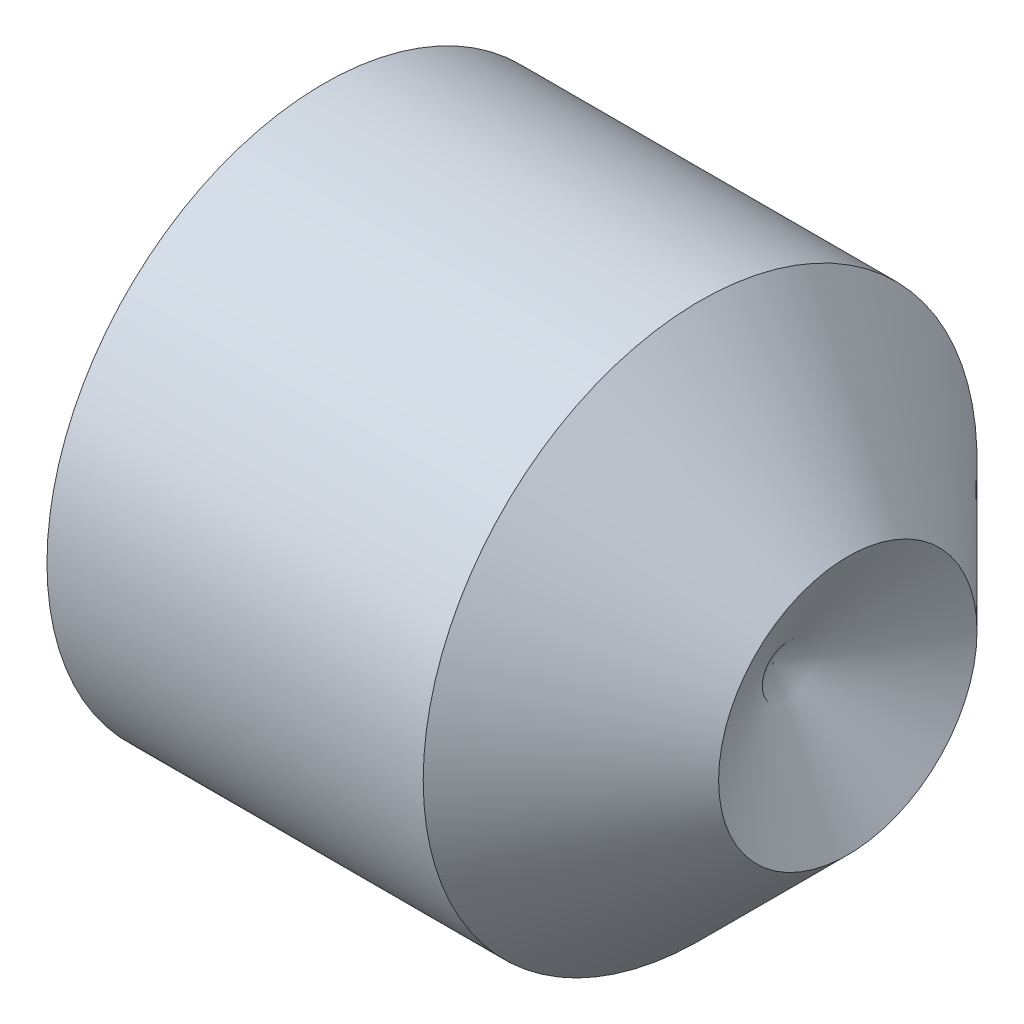
ISO-10303-21;
HEADER;
FILE_DESCRIPTION(('STEP AP214'),'2;1');
FILE_NAME('part.step','',(''),(''),'','','');
FILE_SCHEMA(('AUTOMOTIVE_DESIGN { 1 0 10303 214 1 1 1 1 }'));
ENDSEC;
DATA;
#1=APPLICATION_CONTEXT('core data for automotive mechanical design processes');
#2=APPLICATION_PROTOCOL_DEFINITION('international standard','automotive_design',2000,#1);
#3=PRODUCT_CONTEXT('',#1,'mechanical');
#4=PRODUCT('Part','Part','',(#3));
#5=PRODUCT_RELATED_PRODUCT_CATEGORY('part','',(#4));
#6=PRODUCT_DEFINITION_FORMATION('','',#4);
#7=PRODUCT_DEFINITION_CONTEXT('part definition',#1,'design');
#8=PRODUCT_DEFINITION('design','',#6,#7);
#9=PRODUCT_DEFINITION_SHAPE('','',#8);
#10=(LENGTH_UNIT() NAMED_UNIT(*) SI_UNIT(.MILLI.,.METRE.));
#11=(NAMED_UNIT(*) PLANE_ANGLE_UNIT() SI_UNIT($,.RADIAN.));
#12=(NAMED_UNIT(*) SI_UNIT($,.STERADIAN.) SOLID_ANGLE_UNIT());
#13=UNCERTAINTY_MEASURE_WITH_UNIT(LENGTH_MEASURE(1.E-05),#10,'distance_accuracy_value','');
#14=(GEOMETRIC_REPRESENTATION_CONTEXT(3) GLOBAL_UNCERTAINTY_ASSIGNED_CONTEXT((#13)) GLOBAL_UNIT_ASSIGNED_CONTEXT((#10,
#11,#12)) REPRESENTATION_CONTEXT('',''));
#15=CARTESIAN_POINT('',(0.,0.,0.));
#16=DIRECTION('',(0.,0.,1.));
#17=DIRECTION('',(1.,0.,0.));
#18=AXIS2_PLACEMENT_3D('',#15,#16,#17);
#19=CARTESIAN_POINT('',(0.,0.,0.));
#20=DIRECTION('',(-1.,0.,0.));
#21=DIRECTION('',(0.,0.,1.));
#22=AXIS2_PLACEMENT_3D('',#19,#20,#21);
#23=PLANE('',#22);
#24=CARTESIAN_POINT('',(0.,0.,0.));
#25=DIRECTION('',(-1.,0.,0.));
#26=DIRECTION('',(0.,0.,1.));
#27=AXIS2_PLACEMENT_3D('',#24,#25,#26);
#28=CIRCLE('',#27,1.2195);
#29=CARTESIAN_POINT('',(0.,0.,1.2195));
#30=VERTEX_POINT('',#29);
#31=EDGE_CURVE('E11',#30,#30,#28,.T.);
#32=ORIENTED_EDGE('',*,*,#31,.T.);
#33=EDGE_LOOP('',(#32));
#34=FACE_BOUND('',#33,.T.);
#35=DIRECTION('',(0.,0.,-1.));
#36=VECTOR('',#35,1.);
#37=CARTESIAN_POINT('',(0.,0.750000000000003,0.433012701892216));
#38=LINE('',#37,#36);
#39=CARTESIAN_POINT('',(0.,0.750000000000003,0.433012701892216));
#40=VERTEX_POINT('',#39);
#41=CARTESIAN_POINT('',(0.,0.750000000000003,-0.433012701892222));
#42=VERTEX_POINT('',#41);
#43=EDGE_CURVE('E98',#40,#42,#38,.T.);
#44=ORIENTED_EDGE('',*,*,#43,.F.);
#45=DIRECTION('',(0.,-0.866025403784439,0.5));
#46=VECTOR('',#45,1.);
#47=CARTESIAN_POINT('',(0.,0.750000000000003,0.433012701892216));
#48=LINE('',#47,#46);
#49=CARTESIAN_POINT('',(0.,0.,0.866025403784435));
#50=VERTEX_POINT('',#49);
#51=EDGE_CURVE('E51',#40,#50,#48,.T.);
#52=ORIENTED_EDGE('',*,*,#51,.T.);
#53=DIRECTION('',(0.,0.866025403784439,0.5));
#54=VECTOR('',#53,1.);
#55=CARTESIAN_POINT('',(0.,-0.749999999999996,0.433012701892216));
#56=LINE('',#55,#54);
#57=CARTESIAN_POINT('',(0.,-0.749999999999996,0.433012701892216));
#58=VERTEX_POINT('',#57);
#59=EDGE_CURVE('E104',#58,#50,#56,.T.);
#60=ORIENTED_EDGE('',*,*,#59,.F.);
#61=DIRECTION('',(0.,0.,-1.));
#62=VECTOR('',#61,1.);
#63=CARTESIAN_POINT('',(0.,-0.749999999999996,0.433012701892216));
#64=LINE('',#63,#62);
#65=CARTESIAN_POINT('',(0.,-0.749999999999996,-0.433012701892222));
#66=VERTEX_POINT('',#65);
#67=EDGE_CURVE('E124',#58,#66,#64,.T.);
#68=ORIENTED_EDGE('',*,*,#67,.T.);
#69=DIRECTION('',(0.,0.866025403784438,-0.500000000000001));
#70=VECTOR('',#69,1.);
#71=CARTESIAN_POINT('',(0.,-0.749999999999996,-0.433012701892222));
#72=LINE('',#71,#70);
#73=CARTESIAN_POINT('',(0.,0.,-0.866025403784441));
#74=VERTEX_POINT('',#73);
#75=EDGE_CURVE('E127',#66,#74,#72,.T.);
#76=ORIENTED_EDGE('',*,*,#75,.T.);
#77=DIRECTION('',(0.,-0.866025403784439,-0.5));
#78=VECTOR('',#77,1.);
#79=CARTESIAN_POINT('',(0.,0.750000000000003,-0.433012701892222));
#80=LINE('',#79,#78);
#81=EDGE_CURVE('E130',#42,#74,#80,.T.);
#82=ORIENTED_EDGE('',*,*,#81,.F.);
#83=EDGE_LOOP('',(#44,#52,#60,#68,#76,#82));
#84=FACE_BOUND('',#83,.T.);
#85=ADVANCED_FACE('F37',(#34,#84),#23,.T.);
#86=CARTESIAN_POINT('',(0.,0.,0.));
#87=DIRECTION('',(1.,0.,0.));
#88=DIRECTION('',(0.,0.,-1.));
#89=AXIS2_PLACEMENT_3D('',#86,#87,#88);
#90=CONICAL_SURFACE('',#89,1.2195,1.0471975511966);
#91=CARTESIAN_POINT('',(0.161946750507689,0.,0.));
#92=DIRECTION('',(-1.,0.,0.));
#93=DIRECTION('',(0.,0.,1.));
#94=AXIS2_PLACEMENT_3D('',#91,#92,#93);
#95=CIRCLE('',#94,1.5);
#96=CARTESIAN_POINT('',(0.161946750507689,0.,1.5));
#97=VERTEX_POINT('',#96);
#98=EDGE_CURVE('E44',#97,#97,#95,.T.);
#99=ORIENTED_EDGE('',*,*,#98,.T.);
#100=EDGE_LOOP('',(#99));
#101=FACE_BOUND('',#100,.T.);
#102=ORIENTED_EDGE('',*,*,#31,.F.);
#103=EDGE_LOOP('',(#102));
#104=FACE_BOUND('',#103,.T.);
#105=ADVANCED_FACE('F150',(#101,#104),#90,.T.);
#106=CARTESIAN_POINT('',(-12.7,0.,0.));
#107=DIRECTION('',(-1.,0.,0.));
#108=DIRECTION('',(0.,0.,1.));
#109=AXIS2_PLACEMENT_3D('',#106,#107,#108);
#110=CYLINDRICAL_SURFACE('',#109,1.5);
#111=CARTESIAN_POINT('',(2.2,0.,0.));
#112=DIRECTION('',(-1.,0.,0.));
#113=DIRECTION('',(0.,0.,1.));
#114=AXIS2_PLACEMENT_3D('',#111,#112,#113);
#115=CIRCLE('',#114,1.5);
#116=CARTESIAN_POINT('',(2.2,0.,1.5));
#117=VERTEX_POINT('',#116);
#118=EDGE_CURVE('E145',#117,#117,#115,.T.);
#119=ORIENTED_EDGE('',*,*,#118,.T.);
#120=EDGE_LOOP('',(#119));
#121=FACE_BOUND('',#120,.T.);
#122=ORIENTED_EDGE('',*,*,#98,.F.);
#123=EDGE_LOOP('',(#122));
#124=FACE_BOUND('',#123,.T.);
#125=ADVANCED_FACE('F153',(#121,#124),#110,.T.);
#126=CARTESIAN_POINT('',(2.2,0.,0.));
#127=DIRECTION('',(-1.,0.,0.));
#128=DIRECTION('',(0.,0.,1.));
#129=AXIS2_PLACEMENT_3D('',#126,#127,#128);
#130=CONICAL_SURFACE('',#129,1.5,0.785398163397449);
#131=CARTESIAN_POINT('',(3.,0.,0.));
#132=DIRECTION('',(-1.,0.,0.));
#133=DIRECTION('',(0.,0.,1.));
#134=AXIS2_PLACEMENT_3D('',#131,#132,#133);
#135=CIRCLE('',#134,0.7);
#136=CARTESIAN_POINT('',(3.,0.,0.7));
#137=VERTEX_POINT('',#136);
#138=EDGE_CURVE('E105',#137,#137,#135,.T.);
#139=ORIENTED_EDGE('',*,*,#138,.T.);
#140=EDGE_LOOP('',(#139));
#141=FACE_BOUND('',#140,.T.);
#142=ORIENTED_EDGE('',*,*,#118,.F.);
#143=EDGE_LOOP('',(#142));
#144=FACE_BOUND('',#143,.T.);
#145=ADVANCED_FACE('F155',(#141,#144),#130,.T.);
#146=CARTESIAN_POINT('',(2.59585481156726,0.,0.));
#147=DIRECTION('',(1.,0.,0.));
#148=DIRECTION('',(0.,0.,-1.));
#149=AXIS2_PLACEMENT_3D('',#146,#147,#148);
#150=CONICAL_SURFACE('',#149,0.,1.0471975511966);
#151=ORIENTED_EDGE('',*,*,#138,.F.);
#152=EDGE_LOOP('',(#151));
#153=FACE_BOUND('',#152,.T.);
#154=CARTESIAN_POINT('',(2.59585481156726,0.,0.));
#155=VERTEX_POINT('',#154);
#156=VERTEX_LOOP('',#155);
#157=FACE_BOUND('',#156,.T.);
#158=ADVANCED_FACE('F162',(#153,#157),#150,.F.);
#159=CARTESIAN_POINT('',(1.2,0.750000000000003,0.433012701892216));
#160=DIRECTION('',(0.,-0.5,-0.866025403784438));
#161=DIRECTION('',(0.,0.866025403784438,-0.5));
#162=AXIS2_PLACEMENT_3D('',#159,#160,#161);
#163=PLANE('',#162);
#164=ORIENTED_EDGE('',*,*,#51,.F.);
#165=DIRECTION('',(-1.,0.,0.));
#166=VECTOR('',#165,1.);
#167=CARTESIAN_POINT('',(1.2,0.750000000000003,0.433012701892216));
#168=LINE('',#167,#166);
#169=CARTESIAN_POINT('',(1.2,0.750000000000003,0.433012701892216));
#170=VERTEX_POINT('',#169);
#171=EDGE_CURVE('E92',#170,#40,#168,.T.);
#172=ORIENTED_EDGE('',*,*,#171,.F.);
#173=DIRECTION('',(0.,-0.866025403784439,0.5));
#174=VECTOR('',#173,1.);
#175=CARTESIAN_POINT('',(1.2,0.750000000000003,0.433012701892216));
#176=LINE('',#175,#174);
#177=CARTESIAN_POINT('',(1.2,0.,0.866025403784435));
#178=VERTEX_POINT('',#177);
#179=EDGE_CURVE('E87',#170,#178,#176,.T.);
#180=ORIENTED_EDGE('',*,*,#179,.T.);
#181=DIRECTION('',(-1.,0.,0.));
#182=VECTOR('',#181,1.);
#183=CARTESIAN_POINT('',(1.2,0.,0.866025403784435));
#184=LINE('',#183,#182);
#185=EDGE_CURVE('E90',#178,#50,#184,.T.);
#186=ORIENTED_EDGE('',*,*,#185,.T.);
#187=EDGE_LOOP('',(#164,#172,#180,#186));
#188=FACE_BOUND('',#187,.T.);
#189=ADVANCED_FACE('F89',(#188),#163,.T.);
#190=CARTESIAN_POINT('',(1.2,-0.749999999999996,0.433012701892216));
#191=DIRECTION('',(0.,-0.5,0.866025403784439));
#192=DIRECTION('',(0.,-0.866025403784439,-0.5));
#193=AXIS2_PLACEMENT_3D('',#190,#191,#192);
#194=PLANE('',#193);
#195=ORIENTED_EDGE('',*,*,#59,.T.);
#196=ORIENTED_EDGE('',*,*,#185,.F.);
#197=DIRECTION('',(0.,0.866025403784439,0.5));
#198=VECTOR('',#197,1.);
#199=CARTESIAN_POINT('',(1.2,-0.749999999999996,0.433012701892216));
#200=LINE('',#199,#198);
#201=CARTESIAN_POINT('',(1.2,-0.749999999999996,0.433012701892216));
#202=VERTEX_POINT('',#201);
#203=EDGE_CURVE('E97',#202,#178,#200,.T.);
#204=ORIENTED_EDGE('',*,*,#203,.F.);
#205=DIRECTION('',(-1.,0.,0.));
#206=VECTOR('',#205,1.);
#207=CARTESIAN_POINT('',(1.2,-0.749999999999996,0.433012701892216));
#208=LINE('',#207,#206);
#209=EDGE_CURVE('E106',#202,#58,#208,.T.);
#210=ORIENTED_EDGE('',*,*,#209,.T.);
#211=EDGE_LOOP('',(#195,#196,#204,#210));
#212=FACE_BOUND('',#211,.T.);
#213=ADVANCED_FACE('F102',(#212),#194,.F.);
#214=CARTESIAN_POINT('',(1.2,-0.749999999999996,0.433012701892216));
#215=DIRECTION('',(0.,1.,0.));
#216=DIRECTION('',(0.,0.,1.));
#217=AXIS2_PLACEMENT_3D('',#214,#215,#216);
#218=PLANE('',#217);
#219=ORIENTED_EDGE('',*,*,#67,.F.);
#220=ORIENTED_EDGE('',*,*,#209,.F.);
#221=DIRECTION('',(0.,0.,-1.));
#222=VECTOR('',#221,1.);
#223=CARTESIAN_POINT('',(1.2,-0.749999999999996,0.433012701892216));
#224=LINE('',#223,#222);
#225=CARTESIAN_POINT('',(1.2,-0.749999999999996,-0.433012701892222));
#226=VERTEX_POINT('',#225);
#227=EDGE_CURVE('E111',#202,#226,#224,.T.);
#228=ORIENTED_EDGE('',*,*,#227,.T.);
#229=DIRECTION('',(-1.,0.,0.));
#230=VECTOR('',#229,1.);
#231=CARTESIAN_POINT('',(1.2,-0.749999999999996,-0.433012701892222));
#232=LINE('',#231,#230);
#233=EDGE_CURVE('E140',#226,#66,#232,.T.);
#234=ORIENTED_EDGE('',*,*,#233,.T.);
#235=EDGE_LOOP('',(#219,#220,#228,#234));
#236=FACE_BOUND('',#235,.T.);
#237=ADVANCED_FACE('F185',(#236),#218,.T.);
#238=CARTESIAN_POINT('',(1.2,-0.749999999999996,-0.433012701892222));
#239=DIRECTION('',(0.,0.500000000000001,0.866025403784438));
#240=DIRECTION('',(0.,-0.866025403784438,0.500000000000001));
#241=AXIS2_PLACEMENT_3D('',#238,#239,#240);
#242=PLANE('',#241);
#243=ORIENTED_EDGE('',*,*,#75,.F.);
#244=ORIENTED_EDGE('',*,*,#233,.F.);
#245=DIRECTION('',(0.,0.866025403784438,-0.500000000000001));
#246=VECTOR('',#245,1.);
#247=CARTESIAN_POINT('',(1.2,-0.749999999999996,-0.433012701892222));
#248=LINE('',#247,#246);
#249=CARTESIAN_POINT('',(1.2,0.,-0.866025403784441));
#250=VERTEX_POINT('',#249);
#251=EDGE_CURVE('E113',#226,#250,#248,.T.);
#252=ORIENTED_EDGE('',*,*,#251,.T.);
#253=DIRECTION('',(-1.,0.,0.));
#254=VECTOR('',#253,1.);
#255=CARTESIAN_POINT('',(1.2,0.,-0.866025403784441));
#256=LINE('',#255,#254);
#257=EDGE_CURVE('E138',#250,#74,#256,.T.);
#258=ORIENTED_EDGE('',*,*,#257,.T.);
#259=EDGE_LOOP('',(#243,#244,#252,#258));
#260=FACE_BOUND('',#259,.T.);
#261=ADVANCED_FACE('F181',(#260),#242,.T.);
#262=CARTESIAN_POINT('',(1.2,0.750000000000003,-0.433012701892222));
#263=DIRECTION('',(0.,0.5,-0.866025403784439));
#264=DIRECTION('',(0.,0.866025403784439,0.5));
#265=AXIS2_PLACEMENT_3D('',#262,#263,#264);
#266=PLANE('',#265);
#267=ORIENTED_EDGE('',*,*,#81,.T.);
#268=ORIENTED_EDGE('',*,*,#257,.F.);
#269=DIRECTION('',(0.,-0.866025403784439,-0.5));
#270=VECTOR('',#269,1.);
#271=CARTESIAN_POINT('',(1.2,0.750000000000003,-0.433012701892222));
#272=LINE('',#271,#270);
#273=CARTESIAN_POINT('',(1.2,0.750000000000003,-0.433012701892222));
#274=VERTEX_POINT('',#273);
#275=EDGE_CURVE('E117',#274,#250,#272,.T.);
#276=ORIENTED_EDGE('',*,*,#275,.F.);
#277=DIRECTION('',(-1.,0.,0.));
#278=VECTOR('',#277,1.);
#279=CARTESIAN_POINT('',(1.2,0.750000000000003,-0.433012701892222));
#280=LINE('',#279,#278);
#281=EDGE_CURVE('E136',#274,#42,#280,.T.);
#282=ORIENTED_EDGE('',*,*,#281,.T.);
#283=EDGE_LOOP('',(#267,#268,#276,#282));
#284=FACE_BOUND('',#283,.T.);
#285=ADVANCED_FACE('F178',(#284),#266,.F.);
#286=CARTESIAN_POINT('',(1.2,0.750000000000003,0.433012701892216));
#287=DIRECTION('',(0.,1.,0.));
#288=DIRECTION('',(0.,0.,1.));
#289=AXIS2_PLACEMENT_3D('',#286,#287,#288);
#290=PLANE('',#289);
#291=ORIENTED_EDGE('',*,*,#43,.T.);
#292=ORIENTED_EDGE('',*,*,#281,.F.);
#293=DIRECTION('',(0.,0.,-1.));
#294=VECTOR('',#293,1.);
#295=CARTESIAN_POINT('',(1.2,0.750000000000003,0.433012701892216));
#296=LINE('',#295,#294);
#297=EDGE_CURVE('E120',#170,#274,#296,.T.);
#298=ORIENTED_EDGE('',*,*,#297,.F.);
#299=ORIENTED_EDGE('',*,*,#171,.T.);
#300=EDGE_LOOP('',(#291,#292,#298,#299));
#301=FACE_BOUND('',#300,.T.);
#302=ADVANCED_FACE('F174',(#301),#290,.F.);
#303=CARTESIAN_POINT('',(1.2,1.5,0.));
#304=DIRECTION('',(1.,0.,0.));
#305=DIRECTION('',(0.,0.,-1.));
#306=AXIS2_PLACEMENT_3D('',#303,#304,#305);
#307=PLANE('',#306);
#308=ORIENTED_EDGE('',*,*,#179,.F.);
#309=ORIENTED_EDGE('',*,*,#297,.T.);
#310=ORIENTED_EDGE('',*,*,#275,.T.);
#311=ORIENTED_EDGE('',*,*,#251,.F.);
#312=ORIENTED_EDGE('',*,*,#227,.F.);
#313=ORIENTED_EDGE('',*,*,#203,.T.);
#314=EDGE_LOOP('',(#308,#309,#310,#311,#312,#313));
#315=FACE_BOUND('',#314,.T.);
#316=ADVANCED_FACE('F109',(#315),#307,.F.);
#317=CLOSED_SHELL('',(#85,#105,#125,#145,#158,#189,#213,#237,#261,#285,#302,#316));
#318=MANIFOLD_SOLID_BREP('B2',#317);
#319=ADVANCED_BREP_SHAPE_REPRESENTATION('',(#18,#318),#14);
#320=SHAPE_DEFINITION_REPRESENTATION(#9,#319);
ENDSEC;
END-ISO-10303-21;
